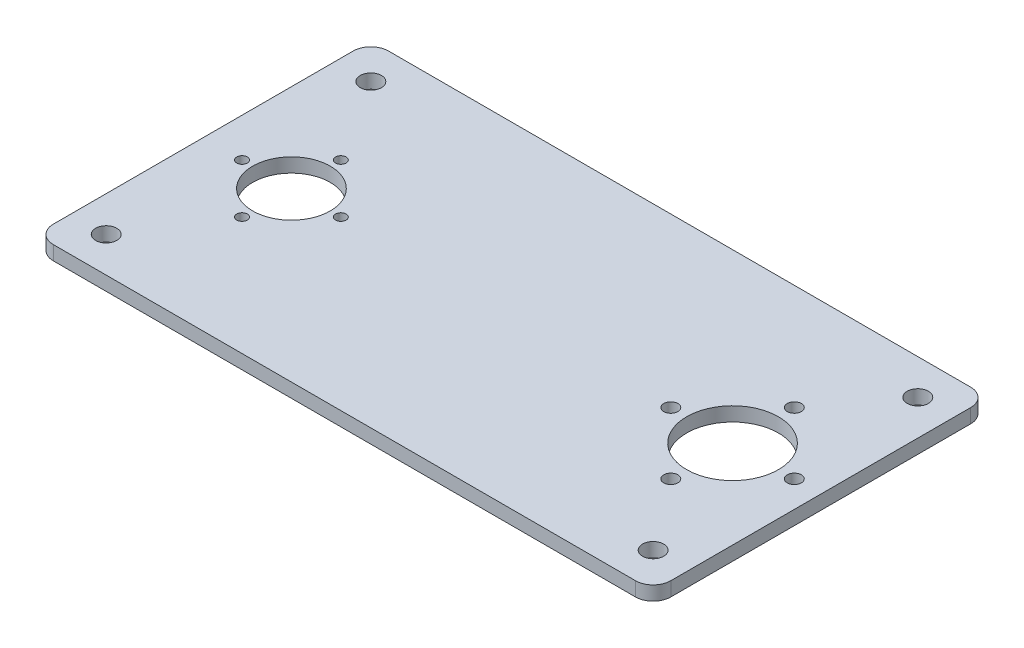
ISO-10303-21;
HEADER;
FILE_DESCRIPTION(('STEP AP214'),'2;1');
FILE_NAME('part.step','',(''),(''),'','','');
FILE_SCHEMA(('AUTOMOTIVE_DESIGN { 1 0 10303 214 1 1 1 1 }'));
ENDSEC;
DATA;
#1=APPLICATION_CONTEXT('core data for automotive mechanical design processes');
#2=APPLICATION_PROTOCOL_DEFINITION('international standard','automotive_design',2000,#1);
#3=PRODUCT_CONTEXT('',#1,'mechanical');
#4=PRODUCT('Part','Part','',(#3));
#5=PRODUCT_RELATED_PRODUCT_CATEGORY('part','',(#4));
#6=PRODUCT_DEFINITION_FORMATION('','',#4);
#7=PRODUCT_DEFINITION_CONTEXT('part definition',#1,'design');
#8=PRODUCT_DEFINITION('design','',#6,#7);
#9=PRODUCT_DEFINITION_SHAPE('','',#8);
#10=(LENGTH_UNIT() NAMED_UNIT(*) SI_UNIT(.MILLI.,.METRE.));
#11=(NAMED_UNIT(*) PLANE_ANGLE_UNIT() SI_UNIT($,.RADIAN.));
#12=(NAMED_UNIT(*) SI_UNIT($,.STERADIAN.) SOLID_ANGLE_UNIT());
#13=UNCERTAINTY_MEASURE_WITH_UNIT(LENGTH_MEASURE(1.E-05),#10,'distance_accuracy_value','');
#14=(GEOMETRIC_REPRESENTATION_CONTEXT(3) GLOBAL_UNCERTAINTY_ASSIGNED_CONTEXT((#13)) GLOBAL_UNIT_ASSIGNED_CONTEXT((#10,
#11,#12)) REPRESENTATION_CONTEXT('',''));
#15=CARTESIAN_POINT('',(0.,0.,0.));
#16=DIRECTION('',(0.,0.,1.));
#17=DIRECTION('',(1.,0.,0.));
#18=AXIS2_PLACEMENT_3D('',#15,#16,#17);
#19=CARTESIAN_POINT('',(0.,4.,0.));
#20=DIRECTION('',(0.,1.,0.));
#21=DIRECTION('',(0.,0.,1.));
#22=AXIS2_PLACEMENT_3D('',#19,#20,#21);
#23=PLANE('',#22);
#24=CARTESIAN_POINT('',(15.,4.,37.5));
#25=DIRECTION('',(0.,1.,0.));
#26=DIRECTION('',(0.,0.,1.));
#27=AXIS2_PLACEMENT_3D('',#24,#25,#26);
#28=CIRCLE('',#27,3.);
#29=CARTESIAN_POINT('',(15.,4.,40.5));
#30=VERTEX_POINT('',#29);
#31=EDGE_CURVE('E245',#30,#30,#28,.T.);
#32=ORIENTED_EDGE('',*,*,#31,.F.);
#33=EDGE_LOOP('',(#32));
#34=FACE_BOUND('',#33,.T.);
#35=CARTESIAN_POINT('',(-140.,4.,37.5));
#36=DIRECTION('',(0.,1.,0.));
#37=DIRECTION('',(0.,0.,1.));
#38=AXIS2_PLACEMENT_3D('',#35,#36,#37);
#39=CIRCLE('',#38,2.99999999999999);
#40=CARTESIAN_POINT('',(-140.,4.,40.5));
#41=VERTEX_POINT('',#40);
#42=EDGE_CURVE('E233',#41,#41,#39,.T.);
#43=ORIENTED_EDGE('',*,*,#42,.F.);
#44=EDGE_LOOP('',(#43));
#45=FACE_BOUND('',#44,.T.);
#46=CARTESIAN_POINT('',(-125.,4.,14.));
#47=DIRECTION('',(0.,1.,0.));
#48=DIRECTION('',(0.,0.,1.));
#49=AXIS2_PLACEMENT_3D('',#46,#47,#48);
#50=CIRCLE('',#49,1.50000000000001);
#51=CARTESIAN_POINT('',(-125.,4.,15.5));
#52=VERTEX_POINT('',#51);
#53=EDGE_CURVE('E221',#52,#52,#50,.T.);
#54=ORIENTED_EDGE('',*,*,#53,.F.);
#55=EDGE_LOOP('',(#54));
#56=FACE_BOUND('',#55,.T.);
#57=CARTESIAN_POINT('',(-17.5,4.,-1.83302770289265E-13));
#58=DIRECTION('',(0.,1.,0.));
#59=DIRECTION('',(0.,0.,1.));
#60=AXIS2_PLACEMENT_3D('',#57,#58,#59);
#61=CIRCLE('',#60,2.);
#62=CARTESIAN_POINT('',(-17.5,4.,1.99999999999982));
#63=VERTEX_POINT('',#62);
#64=EDGE_CURVE('E209',#63,#63,#61,.T.);
#65=ORIENTED_EDGE('',*,*,#64,.F.);
#66=EDGE_LOOP('',(#65));
#67=FACE_BOUND('',#66,.T.);
#68=CARTESIAN_POINT('',(17.5,4.,0.));
#69=DIRECTION('',(0.,1.,0.));
#70=DIRECTION('',(0.,0.,1.));
#71=AXIS2_PLACEMENT_3D('',#68,#69,#70);
#72=CIRCLE('',#71,2.);
#73=CARTESIAN_POINT('',(17.5,4.,2.00000000000006));
#74=VERTEX_POINT('',#73);
#75=EDGE_CURVE('E197',#74,#74,#72,.T.);
#76=ORIENTED_EDGE('',*,*,#75,.F.);
#77=EDGE_LOOP('',(#76));
#78=FACE_BOUND('',#77,.T.);
#79=CARTESIAN_POINT('',(0.,4.,-17.5));
#80=DIRECTION('',(0.,1.,0.));
#81=DIRECTION('',(0.,0.,1.));
#82=AXIS2_PLACEMENT_3D('',#79,#80,#81);
#83=CIRCLE('',#82,2.);
#84=CARTESIAN_POINT('',(0.,4.,-15.5));
#85=VERTEX_POINT('',#84);
#86=EDGE_CURVE('E185',#85,#85,#83,.T.);
#87=ORIENTED_EDGE('',*,*,#86,.F.);
#88=EDGE_LOOP('',(#87));
#89=FACE_BOUND('',#88,.T.);
#90=CARTESIAN_POINT('',(0.,4.,0.));
#91=DIRECTION('',(0.,1.,0.));
#92=DIRECTION('',(0.,0.,1.));
#93=AXIS2_PLACEMENT_3D('',#90,#91,#92);
#94=CIRCLE('',#93,13.);
#95=CARTESIAN_POINT('',(0.,4.,13.));
#96=VERTEX_POINT('',#95);
#97=EDGE_CURVE('E168',#96,#96,#94,.T.);
#98=ORIENTED_EDGE('',*,*,#97,.F.);
#99=EDGE_LOOP('',(#98));
#100=FACE_BOUND('',#99,.T.);
#101=DIRECTION('',(1.,0.,0.));
#102=VECTOR('',#101,1.);
#103=CARTESIAN_POINT('',(-150.,4.,47.5));
#104=LINE('',#103,#102);
#105=CARTESIAN_POINT('',(-145.,4.,47.5));
#106=VERTEX_POINT('',#105);
#107=CARTESIAN_POINT('',(20.,4.,47.5));
#108=VERTEX_POINT('',#107);
#109=EDGE_CURVE('E175',#106,#108,#104,.T.);
#110=ORIENTED_EDGE('',*,*,#109,.T.);
#111=CARTESIAN_POINT('',(20.,4.,42.5));
#112=DIRECTION('',(0.,1.,0.));
#113=DIRECTION('',(0.,0.,1.));
#114=AXIS2_PLACEMENT_3D('',#111,#112,#113);
#115=CIRCLE('',#114,5.);
#116=CARTESIAN_POINT('',(25.,4.,42.5));
#117=VERTEX_POINT('',#116);
#118=EDGE_CURVE('E152',#108,#117,#115,.T.);
#119=ORIENTED_EDGE('',*,*,#118,.T.);
#120=DIRECTION('',(0.,0.,-1.));
#121=VECTOR('',#120,1.);
#122=CARTESIAN_POINT('',(25.,4.,-47.5));
#123=LINE('',#122,#121);
#124=CARTESIAN_POINT('',(25.,4.,-42.5));
#125=VERTEX_POINT('',#124);
#126=EDGE_CURVE('E122',#117,#125,#123,.T.);
#127=ORIENTED_EDGE('',*,*,#126,.T.);
#128=CARTESIAN_POINT('',(20.,4.,-42.5));
#129=DIRECTION('',(0.,1.,0.));
#130=DIRECTION('',(0.,0.,1.));
#131=AXIS2_PLACEMENT_3D('',#128,#129,#130);
#132=CIRCLE('',#131,5.);
#133=CARTESIAN_POINT('',(20.,4.,-47.5));
#134=VERTEX_POINT('',#133);
#135=EDGE_CURVE('E59',#125,#134,#132,.T.);
#136=ORIENTED_EDGE('',*,*,#135,.T.);
#137=DIRECTION('',(-1.,0.,0.));
#138=VECTOR('',#137,1.);
#139=CARTESIAN_POINT('',(-150.,4.,-47.5));
#140=LINE('',#139,#138);
#141=CARTESIAN_POINT('',(-145.,4.,-47.5));
#142=VERTEX_POINT('',#141);
#143=EDGE_CURVE('E138',#134,#142,#140,.T.);
#144=ORIENTED_EDGE('',*,*,#143,.T.);
#145=CARTESIAN_POINT('',(-145.,4.,-42.5));
#146=DIRECTION('',(0.,1.,0.));
#147=DIRECTION('',(0.,0.,1.));
#148=AXIS2_PLACEMENT_3D('',#145,#146,#147);
#149=CIRCLE('',#148,5.);
#150=CARTESIAN_POINT('',(-150.,4.,-42.5));
#151=VERTEX_POINT('',#150);
#152=EDGE_CURVE('E147',#142,#151,#149,.T.);
#153=ORIENTED_EDGE('',*,*,#152,.T.);
#154=DIRECTION('',(0.,0.,1.));
#155=VECTOR('',#154,1.);
#156=CARTESIAN_POINT('',(-150.,4.,-47.5));
#157=LINE('',#156,#155);
#158=CARTESIAN_POINT('',(-150.,4.,42.5));
#159=VERTEX_POINT('',#158);
#160=EDGE_CURVE('E132',#151,#159,#157,.T.);
#161=ORIENTED_EDGE('',*,*,#160,.T.);
#162=CARTESIAN_POINT('',(-145.,4.,42.5));
#163=DIRECTION('',(0.,1.,0.));
#164=DIRECTION('',(0.,0.,1.));
#165=AXIS2_PLACEMENT_3D('',#162,#163,#164);
#166=CIRCLE('',#165,5.);
#167=EDGE_CURVE('E149',#159,#106,#166,.T.);
#168=ORIENTED_EDGE('',*,*,#167,.T.);
#169=EDGE_LOOP('',(#110,#119,#127,#136,#144,#153,#161,#168));
#170=FACE_BOUND('',#169,.T.);
#171=CARTESIAN_POINT('',(-125.,4.,0.));
#172=DIRECTION('',(0.,1.,0.));
#173=DIRECTION('',(0.,0.,1.));
#174=AXIS2_PLACEMENT_3D('',#171,#172,#173);
#175=CIRCLE('',#174,11.);
#176=CARTESIAN_POINT('',(-125.,4.,11.));
#177=VERTEX_POINT('',#176);
#178=EDGE_CURVE('E180',#177,#177,#175,.T.);
#179=ORIENTED_EDGE('',*,*,#178,.F.);
#180=EDGE_LOOP('',(#179));
#181=FACE_BOUND('',#180,.T.);
#182=CARTESIAN_POINT('',(-125.,4.,-14.));
#183=DIRECTION('',(0.,1.,0.));
#184=DIRECTION('',(0.,0.,1.));
#185=AXIS2_PLACEMENT_3D('',#182,#183,#184);
#186=CIRCLE('',#185,1.5);
#187=CARTESIAN_POINT('',(-125.,4.,-12.5));
#188=VERTEX_POINT('',#187);
#189=EDGE_CURVE('E191',#188,#188,#186,.T.);
#190=ORIENTED_EDGE('',*,*,#189,.F.);
#191=EDGE_LOOP('',(#190));
#192=FACE_BOUND('',#191,.T.);
#193=CARTESIAN_POINT('',(9.88330434368617E-13,4.,17.5));
#194=DIRECTION('',(0.,1.,0.));
#195=DIRECTION('',(0.,0.,1.));
#196=AXIS2_PLACEMENT_3D('',#193,#194,#195);
#197=CIRCLE('',#196,2.00000000000106);
#198=CARTESIAN_POINT('',(9.88330434368617E-13,4.,19.5000000000011));
#199=VERTEX_POINT('',#198);
#200=EDGE_CURVE('E203',#199,#199,#197,.T.);
#201=ORIENTED_EDGE('',*,*,#200,.F.);
#202=EDGE_LOOP('',(#201));
#203=FACE_BOUND('',#202,.T.);
#204=CARTESIAN_POINT('',(-111.,4.,-1.11022302462516E-13));
#205=DIRECTION('',(0.,1.,0.));
#206=DIRECTION('',(0.,0.,1.));
#207=AXIS2_PLACEMENT_3D('',#204,#205,#206);
#208=CIRCLE('',#207,1.49999999999999);
#209=CARTESIAN_POINT('',(-111.,4.,1.49999999999988));
#210=VERTEX_POINT('',#209);
#211=EDGE_CURVE('E215',#210,#210,#208,.T.);
#212=ORIENTED_EDGE('',*,*,#211,.F.);
#213=EDGE_LOOP('',(#212));
#214=FACE_BOUND('',#213,.T.);
#215=CARTESIAN_POINT('',(-140.,4.,-37.5));
#216=DIRECTION('',(0.,1.,0.));
#217=DIRECTION('',(0.,0.,1.));
#218=AXIS2_PLACEMENT_3D('',#215,#216,#217);
#219=CIRCLE('',#218,2.99999999999999);
#220=CARTESIAN_POINT('',(-140.,4.,-34.5));
#221=VERTEX_POINT('',#220);
#222=EDGE_CURVE('E227',#221,#221,#219,.T.);
#223=ORIENTED_EDGE('',*,*,#222,.F.);
#224=EDGE_LOOP('',(#223));
#225=FACE_BOUND('',#224,.T.);
#226=CARTESIAN_POINT('',(15.,4.,-37.5));
#227=DIRECTION('',(0.,1.,0.));
#228=DIRECTION('',(0.,0.,1.));
#229=AXIS2_PLACEMENT_3D('',#226,#227,#228);
#230=CIRCLE('',#229,3.);
#231=CARTESIAN_POINT('',(15.,4.,-34.5));
#232=VERTEX_POINT('',#231);
#233=EDGE_CURVE('E239',#232,#232,#230,.T.);
#234=ORIENTED_EDGE('',*,*,#233,.F.);
#235=EDGE_LOOP('',(#234));
#236=FACE_BOUND('',#235,.T.);
#237=CARTESIAN_POINT('',(-139.,4.,0.));
#238=DIRECTION('',(0.,1.,0.));
#239=DIRECTION('',(0.,0.,1.));
#240=AXIS2_PLACEMENT_3D('',#237,#238,#239);
#241=CIRCLE('',#240,1.49999999999999);
#242=CARTESIAN_POINT('',(-139.,4.,1.50000000000004));
#243=VERTEX_POINT('',#242);
#244=EDGE_CURVE('E251',#243,#243,#241,.T.);
#245=ORIENTED_EDGE('',*,*,#244,.F.);
#246=EDGE_LOOP('',(#245));
#247=FACE_BOUND('',#246,.T.);
#248=ADVANCED_FACE('F37',(#34,#45,#56,#67,#78,#89,#100,#170,#181,#192,#203,#214,#225,#236,#247),
#23,.T.);
#249=CARTESIAN_POINT('',(0.,0.,0.));
#250=DIRECTION('',(0.,1.,0.));
#251=DIRECTION('',(0.,0.,1.));
#252=AXIS2_PLACEMENT_3D('',#249,#250,#251);
#253=PLANE('',#252);
#254=DIRECTION('',(0.,0.,-1.));
#255=VECTOR('',#254,1.);
#256=CARTESIAN_POINT('',(25.,0.,-47.5));
#257=LINE('',#256,#255);
#258=CARTESIAN_POINT('',(25.,0.,42.5));
#259=VERTEX_POINT('',#258);
#260=CARTESIAN_POINT('',(25.,0.,-42.5));
#261=VERTEX_POINT('',#260);
#262=EDGE_CURVE('E120',#259,#261,#257,.T.);
#263=ORIENTED_EDGE('',*,*,#262,.F.);
#264=CARTESIAN_POINT('',(20.,0.,42.5));
#265=DIRECTION('',(0.,1.,0.));
#266=DIRECTION('',(0.,0.,1.));
#267=AXIS2_PLACEMENT_3D('',#264,#265,#266);
#268=CIRCLE('',#267,5.);
#269=CARTESIAN_POINT('',(20.,0.,47.5));
#270=VERTEX_POINT('',#269);
#271=EDGE_CURVE('E103',#259,#270,#268,.F.);
#272=ORIENTED_EDGE('',*,*,#271,.T.);
#273=DIRECTION('',(1.,0.,0.));
#274=VECTOR('',#273,1.);
#275=CARTESIAN_POINT('',(-150.,0.,47.5));
#276=LINE('',#275,#274);
#277=CARTESIAN_POINT('',(-145.,0.,47.5));
#278=VERTEX_POINT('',#277);
#279=EDGE_CURVE('E130',#278,#270,#276,.T.);
#280=ORIENTED_EDGE('',*,*,#279,.F.);
#281=CARTESIAN_POINT('',(-145.,0.,42.5));
#282=DIRECTION('',(0.,1.,0.));
#283=DIRECTION('',(0.,0.,1.));
#284=AXIS2_PLACEMENT_3D('',#281,#282,#283);
#285=CIRCLE('',#284,5.);
#286=CARTESIAN_POINT('',(-150.,0.,42.5));
#287=VERTEX_POINT('',#286);
#288=EDGE_CURVE('E141',#278,#287,#285,.F.);
#289=ORIENTED_EDGE('',*,*,#288,.T.);
#290=DIRECTION('',(0.,0.,1.));
#291=VECTOR('',#290,1.);
#292=CARTESIAN_POINT('',(-150.,0.,-47.5));
#293=LINE('',#292,#291);
#294=CARTESIAN_POINT('',(-150.,0.,-42.5));
#295=VERTEX_POINT('',#294);
#296=EDGE_CURVE('E134',#295,#287,#293,.T.);
#297=ORIENTED_EDGE('',*,*,#296,.F.);
#298=CARTESIAN_POINT('',(-145.,0.,-42.5));
#299=DIRECTION('',(0.,1.,0.));
#300=DIRECTION('',(0.,0.,1.));
#301=AXIS2_PLACEMENT_3D('',#298,#299,#300);
#302=CIRCLE('',#301,5.);
#303=CARTESIAN_POINT('',(-145.,0.,-47.5));
#304=VERTEX_POINT('',#303);
#305=EDGE_CURVE('E123',#295,#304,#302,.F.);
#306=ORIENTED_EDGE('',*,*,#305,.T.);
#307=DIRECTION('',(-1.,0.,0.));
#308=VECTOR('',#307,1.);
#309=CARTESIAN_POINT('',(-150.,0.,-47.5));
#310=LINE('',#309,#308);
#311=CARTESIAN_POINT('',(20.,0.,-47.5));
#312=VERTEX_POINT('',#311);
#313=EDGE_CURVE('E129',#312,#304,#310,.T.);
#314=ORIENTED_EDGE('',*,*,#313,.F.);
#315=CARTESIAN_POINT('',(20.,0.,-42.5));
#316=DIRECTION('',(0.,1.,0.));
#317=DIRECTION('',(0.,0.,1.));
#318=AXIS2_PLACEMENT_3D('',#315,#316,#317);
#319=CIRCLE('',#318,5.);
#320=EDGE_CURVE('E114',#312,#261,#319,.F.);
#321=ORIENTED_EDGE('',*,*,#320,.T.);
#322=EDGE_LOOP('',(#263,#272,#280,#289,#297,#306,#314,#321));
#323=FACE_BOUND('',#322,.T.);
#324=CARTESIAN_POINT('',(0.,0.,0.));
#325=DIRECTION('',(0.,1.,0.));
#326=DIRECTION('',(0.,0.,1.));
#327=AXIS2_PLACEMENT_3D('',#324,#325,#326);
#328=CIRCLE('',#327,13.);
#329=CARTESIAN_POINT('',(0.,0.,13.));
#330=VERTEX_POINT('',#329);
#331=EDGE_CURVE('E170',#330,#330,#328,.T.);
#332=ORIENTED_EDGE('',*,*,#331,.T.);
#333=EDGE_LOOP('',(#332));
#334=FACE_BOUND('',#333,.T.);
#335=CARTESIAN_POINT('',(-125.,0.,0.));
#336=DIRECTION('',(0.,1.,0.));
#337=DIRECTION('',(0.,0.,1.));
#338=AXIS2_PLACEMENT_3D('',#335,#336,#337);
#339=CIRCLE('',#338,11.);
#340=CARTESIAN_POINT('',(-125.,0.,11.));
#341=VERTEX_POINT('',#340);
#342=EDGE_CURVE('E182',#341,#341,#339,.T.);
#343=ORIENTED_EDGE('',*,*,#342,.T.);
#344=EDGE_LOOP('',(#343));
#345=FACE_BOUND('',#344,.T.);
#346=CARTESIAN_POINT('',(0.,0.,-17.5));
#347=DIRECTION('',(0.,1.,0.));
#348=DIRECTION('',(0.,0.,1.));
#349=AXIS2_PLACEMENT_3D('',#346,#347,#348);
#350=CIRCLE('',#349,2.);
#351=CARTESIAN_POINT('',(0.,0.,-15.5));
#352=VERTEX_POINT('',#351);
#353=EDGE_CURVE('E188',#352,#352,#350,.T.);
#354=ORIENTED_EDGE('',*,*,#353,.T.);
#355=EDGE_LOOP('',(#354));
#356=FACE_BOUND('',#355,.T.);
#357=CARTESIAN_POINT('',(-125.,0.,-14.));
#358=DIRECTION('',(0.,1.,0.));
#359=DIRECTION('',(0.,0.,1.));
#360=AXIS2_PLACEMENT_3D('',#357,#358,#359);
#361=CIRCLE('',#360,1.5);
#362=CARTESIAN_POINT('',(-125.,0.,-12.5));
#363=VERTEX_POINT('',#362);
#364=EDGE_CURVE('E194',#363,#363,#361,.T.);
#365=ORIENTED_EDGE('',*,*,#364,.T.);
#366=EDGE_LOOP('',(#365));
#367=FACE_BOUND('',#366,.T.);
#368=CARTESIAN_POINT('',(17.5,0.,0.));
#369=DIRECTION('',(0.,1.,0.));
#370=DIRECTION('',(0.,0.,1.));
#371=AXIS2_PLACEMENT_3D('',#368,#369,#370);
#372=CIRCLE('',#371,2.);
#373=CARTESIAN_POINT('',(17.5,0.,2.00000000000006));
#374=VERTEX_POINT('',#373);
#375=EDGE_CURVE('E200',#374,#374,#372,.T.);
#376=ORIENTED_EDGE('',*,*,#375,.T.);
#377=EDGE_LOOP('',(#376));
#378=FACE_BOUND('',#377,.T.);
#379=CARTESIAN_POINT('',(9.88330434368617E-13,0.,17.5));
#380=DIRECTION('',(0.,1.,0.));
#381=DIRECTION('',(0.,0.,1.));
#382=AXIS2_PLACEMENT_3D('',#379,#380,#381);
#383=CIRCLE('',#382,2.00000000000106);
#384=CARTESIAN_POINT('',(9.88330434368617E-13,0.,19.5000000000011));
#385=VERTEX_POINT('',#384);
#386=EDGE_CURVE('E206',#385,#385,#383,.T.);
#387=ORIENTED_EDGE('',*,*,#386,.T.);
#388=EDGE_LOOP('',(#387));
#389=FACE_BOUND('',#388,.T.);
#390=CARTESIAN_POINT('',(-17.5,0.,-1.83302770289265E-13));
#391=DIRECTION('',(0.,1.,0.));
#392=DIRECTION('',(0.,0.,1.));
#393=AXIS2_PLACEMENT_3D('',#390,#391,#392);
#394=CIRCLE('',#393,2.);
#395=CARTESIAN_POINT('',(-17.5,0.,1.99999999999982));
#396=VERTEX_POINT('',#395);
#397=EDGE_CURVE('E212',#396,#396,#394,.T.);
#398=ORIENTED_EDGE('',*,*,#397,.T.);
#399=EDGE_LOOP('',(#398));
#400=FACE_BOUND('',#399,.T.);
#401=CARTESIAN_POINT('',(-111.,0.,-1.11022302462516E-13));
#402=DIRECTION('',(0.,1.,0.));
#403=DIRECTION('',(0.,0.,1.));
#404=AXIS2_PLACEMENT_3D('',#401,#402,#403);
#405=CIRCLE('',#404,1.49999999999999);
#406=CARTESIAN_POINT('',(-111.,0.,1.49999999999988));
#407=VERTEX_POINT('',#406);
#408=EDGE_CURVE('E218',#407,#407,#405,.T.);
#409=ORIENTED_EDGE('',*,*,#408,.T.);
#410=EDGE_LOOP('',(#409));
#411=FACE_BOUND('',#410,.T.);
#412=CARTESIAN_POINT('',(-125.,0.,14.));
#413=DIRECTION('',(0.,1.,0.));
#414=DIRECTION('',(0.,0.,1.));
#415=AXIS2_PLACEMENT_3D('',#412,#413,#414);
#416=CIRCLE('',#415,1.50000000000001);
#417=CARTESIAN_POINT('',(-125.,0.,15.5));
#418=VERTEX_POINT('',#417);
#419=EDGE_CURVE('E224',#418,#418,#416,.T.);
#420=ORIENTED_EDGE('',*,*,#419,.T.);
#421=EDGE_LOOP('',(#420));
#422=FACE_BOUND('',#421,.T.);
#423=CARTESIAN_POINT('',(-140.,0.,-37.5));
#424=DIRECTION('',(0.,1.,0.));
#425=DIRECTION('',(0.,0.,1.));
#426=AXIS2_PLACEMENT_3D('',#423,#424,#425);
#427=CIRCLE('',#426,2.99999999999999);
#428=CARTESIAN_POINT('',(-140.,0.,-34.5));
#429=VERTEX_POINT('',#428);
#430=EDGE_CURVE('E230',#429,#429,#427,.T.);
#431=ORIENTED_EDGE('',*,*,#430,.T.);
#432=EDGE_LOOP('',(#431));
#433=FACE_BOUND('',#432,.T.);
#434=CARTESIAN_POINT('',(-140.,0.,37.5));
#435=DIRECTION('',(0.,1.,0.));
#436=DIRECTION('',(0.,0.,1.));
#437=AXIS2_PLACEMENT_3D('',#434,#435,#436);
#438=CIRCLE('',#437,2.99999999999999);
#439=CARTESIAN_POINT('',(-140.,0.,40.5));
#440=VERTEX_POINT('',#439);
#441=EDGE_CURVE('E236',#440,#440,#438,.T.);
#442=ORIENTED_EDGE('',*,*,#441,.T.);
#443=EDGE_LOOP('',(#442));
#444=FACE_BOUND('',#443,.T.);
#445=CARTESIAN_POINT('',(15.,0.,-37.5));
#446=DIRECTION('',(0.,1.,0.));
#447=DIRECTION('',(0.,0.,1.));
#448=AXIS2_PLACEMENT_3D('',#445,#446,#447);
#449=CIRCLE('',#448,3.);
#450=CARTESIAN_POINT('',(15.,0.,-34.5));
#451=VERTEX_POINT('',#450);
#452=EDGE_CURVE('E242',#451,#451,#449,.T.);
#453=ORIENTED_EDGE('',*,*,#452,.T.);
#454=EDGE_LOOP('',(#453));
#455=FACE_BOUND('',#454,.T.);
#456=CARTESIAN_POINT('',(15.,0.,37.5));
#457=DIRECTION('',(0.,1.,0.));
#458=DIRECTION('',(0.,0.,1.));
#459=AXIS2_PLACEMENT_3D('',#456,#457,#458);
#460=CIRCLE('',#459,3.);
#461=CARTESIAN_POINT('',(15.,0.,40.5));
#462=VERTEX_POINT('',#461);
#463=EDGE_CURVE('E248',#462,#462,#460,.T.);
#464=ORIENTED_EDGE('',*,*,#463,.T.);
#465=EDGE_LOOP('',(#464));
#466=FACE_BOUND('',#465,.T.);
#467=CARTESIAN_POINT('',(-139.,0.,0.));
#468=DIRECTION('',(0.,1.,0.));
#469=DIRECTION('',(0.,0.,1.));
#470=AXIS2_PLACEMENT_3D('',#467,#468,#469);
#471=CIRCLE('',#470,1.49999999999999);
#472=CARTESIAN_POINT('',(-139.,0.,1.50000000000004));
#473=VERTEX_POINT('',#472);
#474=EDGE_CURVE('E254',#473,#473,#471,.T.);
#475=ORIENTED_EDGE('',*,*,#474,.T.);
#476=EDGE_LOOP('',(#475));
#477=FACE_BOUND('',#476,.T.);
#478=ADVANCED_FACE('F126',(#323,#334,#345,#356,#367,#378,#389,#400,#411,#422,#433,#444,#455,
#466,#477),#253,.F.);
#479=CARTESIAN_POINT('',(-150.,4.,-47.5));
#480=DIRECTION('',(1.,0.,0.));
#481=DIRECTION('',(0.,0.,-1.));
#482=AXIS2_PLACEMENT_3D('',#479,#480,#481);
#483=PLANE('',#482);
#484=ORIENTED_EDGE('',*,*,#296,.T.);
#485=DIRECTION('',(0.,-1.,0.));
#486=VECTOR('',#485,1.);
#487=CARTESIAN_POINT('',(-150.,4.,42.5));
#488=LINE('',#487,#486);
#489=EDGE_CURVE('E11',#287,#159,#488,.F.);
#490=ORIENTED_EDGE('',*,*,#489,.T.);
#491=ORIENTED_EDGE('',*,*,#160,.F.);
#492=DIRECTION('',(0.,-1.,0.));
#493=VECTOR('',#492,1.);
#494=CARTESIAN_POINT('',(-150.,4.,-42.5));
#495=LINE('',#494,#493);
#496=EDGE_CURVE('E45',#151,#295,#495,.T.);
#497=ORIENTED_EDGE('',*,*,#496,.T.);
#498=EDGE_LOOP('',(#484,#490,#491,#497));
#499=FACE_BOUND('',#498,.T.);
#500=ADVANCED_FACE('F163',(#499),#483,.F.);
#501=CARTESIAN_POINT('',(-150.,4.,47.5));
#502=DIRECTION('',(0.,0.,-1.));
#503=DIRECTION('',(-1.,0.,0.));
#504=AXIS2_PLACEMENT_3D('',#501,#502,#503);
#505=PLANE('',#504);
#506=ORIENTED_EDGE('',*,*,#279,.T.);
#507=DIRECTION('',(0.,-1.,0.));
#508=VECTOR('',#507,1.);
#509=CARTESIAN_POINT('',(20.,4.,47.5));
#510=LINE('',#509,#508);
#511=EDGE_CURVE('E108',#270,#108,#510,.F.);
#512=ORIENTED_EDGE('',*,*,#511,.T.);
#513=ORIENTED_EDGE('',*,*,#109,.F.);
#514=DIRECTION('',(0.,-1.,0.));
#515=VECTOR('',#514,1.);
#516=CARTESIAN_POINT('',(-145.,4.,47.5));
#517=LINE('',#516,#515);
#518=EDGE_CURVE('E113',#106,#278,#517,.T.);
#519=ORIENTED_EDGE('',*,*,#518,.T.);
#520=EDGE_LOOP('',(#506,#512,#513,#519));
#521=FACE_BOUND('',#520,.T.);
#522=ADVANCED_FACE('F281',(#521),#505,.F.);
#523=CARTESIAN_POINT('',(25.,4.,-47.5));
#524=DIRECTION('',(-1.,0.,0.));
#525=DIRECTION('',(0.,0.,1.));
#526=AXIS2_PLACEMENT_3D('',#523,#524,#525);
#527=PLANE('',#526);
#528=ORIENTED_EDGE('',*,*,#126,.F.);
#529=DIRECTION('',(0.,-1.,0.));
#530=VECTOR('',#529,1.);
#531=CARTESIAN_POINT('',(25.,4.,42.5));
#532=LINE('',#531,#530);
#533=EDGE_CURVE('E107',#117,#259,#532,.T.);
#534=ORIENTED_EDGE('',*,*,#533,.T.);
#535=ORIENTED_EDGE('',*,*,#262,.T.);
#536=DIRECTION('',(0.,-1.,0.));
#537=VECTOR('',#536,1.);
#538=CARTESIAN_POINT('',(25.,4.,-42.5));
#539=LINE('',#538,#537);
#540=EDGE_CURVE('E124',#261,#125,#539,.F.);
#541=ORIENTED_EDGE('',*,*,#540,.T.);
#542=EDGE_LOOP('',(#528,#534,#535,#541));
#543=FACE_BOUND('',#542,.T.);
#544=ADVANCED_FACE('F119',(#543),#527,.F.);
#545=CARTESIAN_POINT('',(-150.,4.,-47.5));
#546=DIRECTION('',(0.,0.,1.));
#547=DIRECTION('',(1.,0.,0.));
#548=AXIS2_PLACEMENT_3D('',#545,#546,#547);
#549=PLANE('',#548);
#550=ORIENTED_EDGE('',*,*,#143,.F.);
#551=DIRECTION('',(0.,-1.,0.));
#552=VECTOR('',#551,1.);
#553=CARTESIAN_POINT('',(20.,4.,-47.5));
#554=LINE('',#553,#552);
#555=EDGE_CURVE('E155',#134,#312,#554,.T.);
#556=ORIENTED_EDGE('',*,*,#555,.T.);
#557=ORIENTED_EDGE('',*,*,#313,.T.);
#558=DIRECTION('',(0.,-1.,0.));
#559=VECTOR('',#558,1.);
#560=CARTESIAN_POINT('',(-145.,4.,-47.5));
#561=LINE('',#560,#559);
#562=EDGE_CURVE('E52',#304,#142,#561,.F.);
#563=ORIENTED_EDGE('',*,*,#562,.T.);
#564=EDGE_LOOP('',(#550,#556,#557,#563));
#565=FACE_BOUND('',#564,.T.);
#566=ADVANCED_FACE('F276',(#565),#549,.F.);
#567=CARTESIAN_POINT('',(0.,4.,0.));
#568=DIRECTION('',(0.,-1.,0.));
#569=DIRECTION('',(0.,0.,-1.));
#570=AXIS2_PLACEMENT_3D('',#567,#568,#569);
#571=CYLINDRICAL_SURFACE('',#570,13.);
#572=ORIENTED_EDGE('',*,*,#97,.T.);
#573=EDGE_LOOP('',(#572));
#574=FACE_BOUND('',#573,.T.);
#575=ORIENTED_EDGE('',*,*,#331,.F.);
#576=EDGE_LOOP('',(#575));
#577=FACE_BOUND('',#576,.T.);
#578=ADVANCED_FACE('F273',(#574,#577),#571,.F.);
#579=CARTESIAN_POINT('',(-125.,4.,0.));
#580=DIRECTION('',(0.,-1.,0.));
#581=DIRECTION('',(0.,0.,-1.));
#582=AXIS2_PLACEMENT_3D('',#579,#580,#581);
#583=CYLINDRICAL_SURFACE('',#582,11.);
#584=ORIENTED_EDGE('',*,*,#178,.T.);
#585=EDGE_LOOP('',(#584));
#586=FACE_BOUND('',#585,.T.);
#587=ORIENTED_EDGE('',*,*,#342,.F.);
#588=EDGE_LOOP('',(#587));
#589=FACE_BOUND('',#588,.T.);
#590=ADVANCED_FACE('F368',(#586,#589),#583,.F.);
#591=CARTESIAN_POINT('',(0.,4.,-17.5));
#592=DIRECTION('',(0.,-1.,0.));
#593=DIRECTION('',(0.,0.,-1.));
#594=AXIS2_PLACEMENT_3D('',#591,#592,#593);
#595=CYLINDRICAL_SURFACE('',#594,2.);
#596=ORIENTED_EDGE('',*,*,#86,.T.);
#597=EDGE_LOOP('',(#596));
#598=FACE_BOUND('',#597,.T.);
#599=ORIENTED_EDGE('',*,*,#353,.F.);
#600=EDGE_LOOP('',(#599));
#601=FACE_BOUND('',#600,.T.);
#602=ADVANCED_FACE('F365',(#598,#601),#595,.F.);
#603=CARTESIAN_POINT('',(-125.,4.,-14.));
#604=DIRECTION('',(0.,-1.,0.));
#605=DIRECTION('',(0.,0.,-1.));
#606=AXIS2_PLACEMENT_3D('',#603,#604,#605);
#607=CYLINDRICAL_SURFACE('',#606,1.5);
#608=ORIENTED_EDGE('',*,*,#189,.T.);
#609=EDGE_LOOP('',(#608));
#610=FACE_BOUND('',#609,.T.);
#611=ORIENTED_EDGE('',*,*,#364,.F.);
#612=EDGE_LOOP('',(#611));
#613=FACE_BOUND('',#612,.T.);
#614=ADVANCED_FACE('F361',(#610,#613),#607,.F.);
#615=CARTESIAN_POINT('',(17.5,4.,0.));
#616=DIRECTION('',(0.,-1.,0.));
#617=DIRECTION('',(0.,0.,-1.));
#618=AXIS2_PLACEMENT_3D('',#615,#616,#617);
#619=CYLINDRICAL_SURFACE('',#618,2.);
#620=ORIENTED_EDGE('',*,*,#75,.T.);
#621=EDGE_LOOP('',(#620));
#622=FACE_BOUND('',#621,.T.);
#623=ORIENTED_EDGE('',*,*,#375,.F.);
#624=EDGE_LOOP('',(#623));
#625=FACE_BOUND('',#624,.T.);
#626=ADVANCED_FACE('F357',(#622,#625),#619,.F.);
#627=CARTESIAN_POINT('',(9.88330434368617E-13,4.,17.5));
#628=DIRECTION('',(0.,-1.,0.));
#629=DIRECTION('',(0.,0.,-1.));
#630=AXIS2_PLACEMENT_3D('',#627,#628,#629);
#631=CYLINDRICAL_SURFACE('',#630,2.00000000000106);
#632=ORIENTED_EDGE('',*,*,#200,.T.);
#633=EDGE_LOOP('',(#632));
#634=FACE_BOUND('',#633,.T.);
#635=ORIENTED_EDGE('',*,*,#386,.F.);
#636=EDGE_LOOP('',(#635));
#637=FACE_BOUND('',#636,.T.);
#638=ADVANCED_FACE('F353',(#634,#637),#631,.F.);
#639=CARTESIAN_POINT('',(-17.5,4.,-1.83302770289265E-13));
#640=DIRECTION('',(0.,-1.,0.));
#641=DIRECTION('',(0.,0.,-1.));
#642=AXIS2_PLACEMENT_3D('',#639,#640,#641);
#643=CYLINDRICAL_SURFACE('',#642,2.);
#644=ORIENTED_EDGE('',*,*,#64,.T.);
#645=EDGE_LOOP('',(#644));
#646=FACE_BOUND('',#645,.T.);
#647=ORIENTED_EDGE('',*,*,#397,.F.);
#648=EDGE_LOOP('',(#647));
#649=FACE_BOUND('',#648,.T.);
#650=ADVANCED_FACE('F349',(#646,#649),#643,.F.);
#651=CARTESIAN_POINT('',(-111.,4.,-1.11022302462516E-13));
#652=DIRECTION('',(0.,-1.,0.));
#653=DIRECTION('',(0.,0.,-1.));
#654=AXIS2_PLACEMENT_3D('',#651,#652,#653);
#655=CYLINDRICAL_SURFACE('',#654,1.49999999999999);
#656=ORIENTED_EDGE('',*,*,#211,.T.);
#657=EDGE_LOOP('',(#656));
#658=FACE_BOUND('',#657,.T.);
#659=ORIENTED_EDGE('',*,*,#408,.F.);
#660=EDGE_LOOP('',(#659));
#661=FACE_BOUND('',#660,.T.);
#662=ADVANCED_FACE('F345',(#658,#661),#655,.F.);
#663=CARTESIAN_POINT('',(-125.,4.,14.));
#664=DIRECTION('',(0.,-1.,0.));
#665=DIRECTION('',(0.,0.,-1.));
#666=AXIS2_PLACEMENT_3D('',#663,#664,#665);
#667=CYLINDRICAL_SURFACE('',#666,1.50000000000001);
#668=ORIENTED_EDGE('',*,*,#53,.T.);
#669=EDGE_LOOP('',(#668));
#670=FACE_BOUND('',#669,.T.);
#671=ORIENTED_EDGE('',*,*,#419,.F.);
#672=EDGE_LOOP('',(#671));
#673=FACE_BOUND('',#672,.T.);
#674=ADVANCED_FACE('F341',(#670,#673),#667,.F.);
#675=CARTESIAN_POINT('',(-140.,4.,-37.5));
#676=DIRECTION('',(0.,-1.,0.));
#677=DIRECTION('',(0.,0.,-1.));
#678=AXIS2_PLACEMENT_3D('',#675,#676,#677);
#679=CYLINDRICAL_SURFACE('',#678,2.99999999999999);
#680=ORIENTED_EDGE('',*,*,#222,.T.);
#681=EDGE_LOOP('',(#680));
#682=FACE_BOUND('',#681,.T.);
#683=ORIENTED_EDGE('',*,*,#430,.F.);
#684=EDGE_LOOP('',(#683));
#685=FACE_BOUND('',#684,.T.);
#686=ADVANCED_FACE('F337',(#682,#685),#679,.F.);
#687=CARTESIAN_POINT('',(-140.,4.,37.5));
#688=DIRECTION('',(0.,-1.,0.));
#689=DIRECTION('',(0.,0.,-1.));
#690=AXIS2_PLACEMENT_3D('',#687,#688,#689);
#691=CYLINDRICAL_SURFACE('',#690,2.99999999999999);
#692=ORIENTED_EDGE('',*,*,#42,.T.);
#693=EDGE_LOOP('',(#692));
#694=FACE_BOUND('',#693,.T.);
#695=ORIENTED_EDGE('',*,*,#441,.F.);
#696=EDGE_LOOP('',(#695));
#697=FACE_BOUND('',#696,.T.);
#698=ADVANCED_FACE('F319',(#694,#697),#691,.F.);
#699=CARTESIAN_POINT('',(15.,4.,-37.5));
#700=DIRECTION('',(0.,-1.,0.));
#701=DIRECTION('',(0.,0.,-1.));
#702=AXIS2_PLACEMENT_3D('',#699,#700,#701);
#703=CYLINDRICAL_SURFACE('',#702,3.);
#704=ORIENTED_EDGE('',*,*,#233,.T.);
#705=EDGE_LOOP('',(#704));
#706=FACE_BOUND('',#705,.T.);
#707=ORIENTED_EDGE('',*,*,#452,.F.);
#708=EDGE_LOOP('',(#707));
#709=FACE_BOUND('',#708,.T.);
#710=ADVANCED_FACE('F315',(#706,#709),#703,.F.);
#711=CARTESIAN_POINT('',(15.,4.,37.5));
#712=DIRECTION('',(0.,-1.,0.));
#713=DIRECTION('',(0.,0.,-1.));
#714=AXIS2_PLACEMENT_3D('',#711,#712,#713);
#715=CYLINDRICAL_SURFACE('',#714,3.);
#716=ORIENTED_EDGE('',*,*,#31,.T.);
#717=EDGE_LOOP('',(#716));
#718=FACE_BOUND('',#717,.T.);
#719=ORIENTED_EDGE('',*,*,#463,.F.);
#720=EDGE_LOOP('',(#719));
#721=FACE_BOUND('',#720,.T.);
#722=ADVANCED_FACE('F318',(#718,#721),#715,.F.);
#723=CARTESIAN_POINT('',(-139.,4.,0.));
#724=DIRECTION('',(0.,-1.,0.));
#725=DIRECTION('',(0.,0.,-1.));
#726=AXIS2_PLACEMENT_3D('',#723,#724,#725);
#727=CYLINDRICAL_SURFACE('',#726,1.49999999999999);
#728=ORIENTED_EDGE('',*,*,#244,.T.);
#729=EDGE_LOOP('',(#728));
#730=FACE_BOUND('',#729,.T.);
#731=ORIENTED_EDGE('',*,*,#474,.F.);
#732=EDGE_LOOP('',(#731));
#733=FACE_BOUND('',#732,.T.);
#734=ADVANCED_FACE('F260',(#730,#733),#727,.F.);
#735=CARTESIAN_POINT('',(20.,4.,42.5));
#736=DIRECTION('',(0.,-1.,0.));
#737=DIRECTION('',(0.,0.,-1.));
#738=AXIS2_PLACEMENT_3D('',#735,#736,#737);
#739=CYLINDRICAL_SURFACE('',#738,5.);
#740=ORIENTED_EDGE('',*,*,#118,.F.);
#741=ORIENTED_EDGE('',*,*,#511,.F.);
#742=ORIENTED_EDGE('',*,*,#271,.F.);
#743=ORIENTED_EDGE('',*,*,#533,.F.);
#744=EDGE_LOOP('',(#740,#741,#742,#743));
#745=FACE_BOUND('',#744,.T.);
#746=ADVANCED_FACE('F106',(#745),#739,.T.);
#747=CARTESIAN_POINT('',(20.,4.,-42.5));
#748=DIRECTION('',(0.,-1.,0.));
#749=DIRECTION('',(0.,0.,-1.));
#750=AXIS2_PLACEMENT_3D('',#747,#748,#749);
#751=CYLINDRICAL_SURFACE('',#750,5.);
#752=ORIENTED_EDGE('',*,*,#135,.F.);
#753=ORIENTED_EDGE('',*,*,#540,.F.);
#754=ORIENTED_EDGE('',*,*,#320,.F.);
#755=ORIENTED_EDGE('',*,*,#555,.F.);
#756=EDGE_LOOP('',(#752,#753,#754,#755));
#757=FACE_BOUND('',#756,.T.);
#758=ADVANCED_FACE('F289',(#757),#751,.T.);
#759=CARTESIAN_POINT('',(-145.,4.,42.5));
#760=DIRECTION('',(0.,-1.,0.));
#761=DIRECTION('',(0.,0.,-1.));
#762=AXIS2_PLACEMENT_3D('',#759,#760,#761);
#763=CYLINDRICAL_SURFACE('',#762,5.);
#764=ORIENTED_EDGE('',*,*,#167,.F.);
#765=ORIENTED_EDGE('',*,*,#489,.F.);
#766=ORIENTED_EDGE('',*,*,#288,.F.);
#767=ORIENTED_EDGE('',*,*,#518,.F.);
#768=EDGE_LOOP('',(#764,#765,#766,#767));
#769=FACE_BOUND('',#768,.T.);
#770=ADVANCED_FACE('F291',(#769),#763,.T.);
#771=CARTESIAN_POINT('',(-145.,4.,-42.5));
#772=DIRECTION('',(0.,-1.,0.));
#773=DIRECTION('',(0.,0.,-1.));
#774=AXIS2_PLACEMENT_3D('',#771,#772,#773);
#775=CYLINDRICAL_SURFACE('',#774,5.);
#776=ORIENTED_EDGE('',*,*,#152,.F.);
#777=ORIENTED_EDGE('',*,*,#562,.F.);
#778=ORIENTED_EDGE('',*,*,#305,.F.);
#779=ORIENTED_EDGE('',*,*,#496,.F.);
#780=EDGE_LOOP('',(#776,#777,#778,#779));
#781=FACE_BOUND('',#780,.T.);
#782=ADVANCED_FACE('F39',(#781),#775,.T.);
#783=CLOSED_SHELL('',(#248,#478,#500,#522,#544,#566,#578,#590,#602,#614,#626,#638,#650,#662,
#674,#686,#698,#710,#722,#734,#746,#758,#770,#782));
#784=MANIFOLD_SOLID_BREP('B2',#783);
#785=ADVANCED_BREP_SHAPE_REPRESENTATION('',(#18,#784),#14);
#786=SHAPE_DEFINITION_REPRESENTATION(#9,#785);
ENDSEC;
END-ISO-10303-21;
